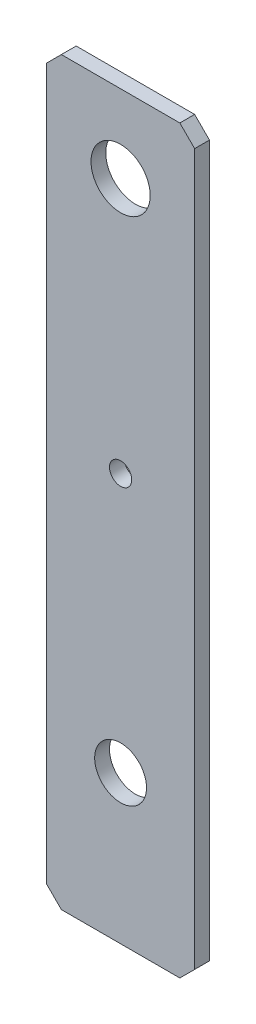
ISO-10303-21;
HEADER;
FILE_DESCRIPTION(('STEP AP214'),'2;1');
FILE_NAME('part.step','',(''),(''),'','','');
FILE_SCHEMA(('AUTOMOTIVE_DESIGN { 1 0 10303 214 1 1 1 1 }'));
ENDSEC;
DATA;
#1=APPLICATION_CONTEXT('core data for automotive mechanical design processes');
#2=APPLICATION_PROTOCOL_DEFINITION('international standard','automotive_design',2000,#1);
#3=PRODUCT_CONTEXT('',#1,'mechanical');
#4=PRODUCT('Part','Part','',(#3));
#5=PRODUCT_RELATED_PRODUCT_CATEGORY('part','',(#4));
#6=PRODUCT_DEFINITION_FORMATION('','',#4);
#7=PRODUCT_DEFINITION_CONTEXT('part definition',#1,'design');
#8=PRODUCT_DEFINITION('design','',#6,#7);
#9=PRODUCT_DEFINITION_SHAPE('','',#8);
#10=(LENGTH_UNIT() NAMED_UNIT(*) SI_UNIT(.MILLI.,.METRE.));
#11=(NAMED_UNIT(*) PLANE_ANGLE_UNIT() SI_UNIT($,.RADIAN.));
#12=(NAMED_UNIT(*) SI_UNIT($,.STERADIAN.) SOLID_ANGLE_UNIT());
#13=UNCERTAINTY_MEASURE_WITH_UNIT(LENGTH_MEASURE(1.E-05),#10,'distance_accuracy_value','');
#14=(GEOMETRIC_REPRESENTATION_CONTEXT(3) GLOBAL_UNCERTAINTY_ASSIGNED_CONTEXT((#13)) GLOBAL_UNIT_ASSIGNED_CONTEXT((#10,
#11,#12)) REPRESENTATION_CONTEXT('',''));
#15=CARTESIAN_POINT('',(0.,0.,0.));
#16=DIRECTION('',(0.,0.,1.));
#17=DIRECTION('',(1.,0.,0.));
#18=AXIS2_PLACEMENT_3D('',#15,#16,#17);
#19=CARTESIAN_POINT('',(9.99999999999999,50.,2.));
#20=DIRECTION('',(-1.,0.,0.));
#21=DIRECTION('',(0.,-1.,0.));
#22=AXIS2_PLACEMENT_3D('',#19,#20,#21);
#23=PLANE('',#22);
#24=DIRECTION('',(0.,1.,0.));
#25=VECTOR('',#24,1.);
#26=CARTESIAN_POINT('',(9.99999999999999,50.,0.));
#27=LINE('',#26,#25);
#28=CARTESIAN_POINT('',(10.,-48.,0.));
#29=VERTEX_POINT('',#28);
#30=CARTESIAN_POINT('',(9.99999999999999,48.,0.));
#31=VERTEX_POINT('',#30);
#32=EDGE_CURVE('E135',#29,#31,#27,.T.);
#33=ORIENTED_EDGE('',*,*,#32,.T.);
#34=DIRECTION('',(0.,0.,1.));
#35=VECTOR('',#34,1.);
#36=CARTESIAN_POINT('',(9.99999999999999,48.,2.));
#37=LINE('',#36,#35);
#38=CARTESIAN_POINT('',(9.99999999999999,48.,2.));
#39=VERTEX_POINT('',#38);
#40=EDGE_CURVE('E113',#31,#39,#37,.T.);
#41=ORIENTED_EDGE('',*,*,#40,.T.);
#42=DIRECTION('',(0.,1.,0.));
#43=VECTOR('',#42,1.);
#44=CARTESIAN_POINT('',(9.99999999999999,50.,2.));
#45=LINE('',#44,#43);
#46=CARTESIAN_POINT('',(10.,-48.,2.));
#47=VERTEX_POINT('',#46);
#48=EDGE_CURVE('E145',#47,#39,#45,.T.);
#49=ORIENTED_EDGE('',*,*,#48,.F.);
#50=DIRECTION('',(0.,0.,-1.));
#51=VECTOR('',#50,1.);
#52=CARTESIAN_POINT('',(10.,-48.,2.));
#53=LINE('',#52,#51);
#54=EDGE_CURVE('E118',#47,#29,#53,.T.);
#55=ORIENTED_EDGE('',*,*,#54,.T.);
#56=EDGE_LOOP('',(#33,#41,#49,#55));
#57=FACE_BOUND('',#56,.T.);
#58=ADVANCED_FACE('F41',(#57),#23,.F.);
#59=CARTESIAN_POINT('',(-10.,50.,2.));
#60=DIRECTION('',(0.,-1.,0.));
#61=DIRECTION('',(0.,0.,-1.));
#62=AXIS2_PLACEMENT_3D('',#59,#60,#61);
#63=PLANE('',#62);
#64=DIRECTION('',(-1.,0.,0.));
#65=VECTOR('',#64,1.);
#66=CARTESIAN_POINT('',(-10.,50.,2.));
#67=LINE('',#66,#65);
#68=CARTESIAN_POINT('',(7.99999999999999,50.,2.));
#69=VERTEX_POINT('',#68);
#70=CARTESIAN_POINT('',(-8.,50.,2.));
#71=VERTEX_POINT('',#70);
#72=EDGE_CURVE('E128',#69,#71,#67,.T.);
#73=ORIENTED_EDGE('',*,*,#72,.F.);
#74=DIRECTION('',(0.,0.,-1.));
#75=VECTOR('',#74,1.);
#76=CARTESIAN_POINT('',(7.99999999999999,50.,2.));
#77=LINE('',#76,#75);
#78=CARTESIAN_POINT('',(7.99999999999999,50.,0.));
#79=VERTEX_POINT('',#78);
#80=EDGE_CURVE('E112',#69,#79,#77,.T.);
#81=ORIENTED_EDGE('',*,*,#80,.T.);
#82=DIRECTION('',(-1.,0.,0.));
#83=VECTOR('',#82,1.);
#84=CARTESIAN_POINT('',(-10.,50.,0.));
#85=LINE('',#84,#83);
#86=CARTESIAN_POINT('',(-8.,50.,0.));
#87=VERTEX_POINT('',#86);
#88=EDGE_CURVE('E125',#79,#87,#85,.T.);
#89=ORIENTED_EDGE('',*,*,#88,.T.);
#90=DIRECTION('',(0.,0.,1.));
#91=VECTOR('',#90,1.);
#92=CARTESIAN_POINT('',(-8.,50.,2.));
#93=LINE('',#92,#91);
#94=EDGE_CURVE('E130',#87,#71,#93,.T.);
#95=ORIENTED_EDGE('',*,*,#94,.T.);
#96=EDGE_LOOP('',(#73,#81,#89,#95));
#97=FACE_BOUND('',#96,.T.);
#98=ADVANCED_FACE('F124',(#97),#63,.F.);
#99=CARTESIAN_POINT('',(-10.,50.,2.));
#100=DIRECTION('',(1.,0.,0.));
#101=DIRECTION('',(0.,1.,0.));
#102=AXIS2_PLACEMENT_3D('',#99,#100,#101);
#103=PLANE('',#102);
#104=DIRECTION('',(0.,-1.,0.));
#105=VECTOR('',#104,1.);
#106=CARTESIAN_POINT('',(-10.,50.,0.));
#107=LINE('',#106,#105);
#108=CARTESIAN_POINT('',(-10.,48.,0.));
#109=VERTEX_POINT('',#108);
#110=CARTESIAN_POINT('',(-9.99999999999999,-48.,0.));
#111=VERTEX_POINT('',#110);
#112=EDGE_CURVE('E134',#109,#111,#107,.T.);
#113=ORIENTED_EDGE('',*,*,#112,.T.);
#114=DIRECTION('',(0.,0.,1.));
#115=VECTOR('',#114,1.);
#116=CARTESIAN_POINT('',(-9.99999999999999,-48.,2.));
#117=LINE('',#116,#115);
#118=CARTESIAN_POINT('',(-9.99999999999999,-48.,2.));
#119=VERTEX_POINT('',#118);
#120=EDGE_CURVE('E11',#111,#119,#117,.T.);
#121=ORIENTED_EDGE('',*,*,#120,.T.);
#122=DIRECTION('',(0.,-1.,0.));
#123=VECTOR('',#122,1.);
#124=CARTESIAN_POINT('',(-10.,50.,2.));
#125=LINE('',#124,#123);
#126=CARTESIAN_POINT('',(-10.,48.,2.));
#127=VERTEX_POINT('',#126);
#128=EDGE_CURVE('E171',#127,#119,#125,.T.);
#129=ORIENTED_EDGE('',*,*,#128,.F.);
#130=DIRECTION('',(0.,0.,-1.));
#131=VECTOR('',#130,1.);
#132=CARTESIAN_POINT('',(-10.,48.,2.));
#133=LINE('',#132,#131);
#134=EDGE_CURVE('E50',#127,#109,#133,.T.);
#135=ORIENTED_EDGE('',*,*,#134,.T.);
#136=EDGE_LOOP('',(#113,#121,#129,#135));
#137=FACE_BOUND('',#136,.T.);
#138=ADVANCED_FACE('F169',(#137),#103,.F.);
#139=CARTESIAN_POINT('',(-9.99999999999999,-50.,2.));
#140=DIRECTION('',(0.,1.,0.));
#141=DIRECTION('',(0.,0.,1.));
#142=AXIS2_PLACEMENT_3D('',#139,#140,#141);
#143=PLANE('',#142);
#144=DIRECTION('',(1.,0.,0.));
#145=VECTOR('',#144,1.);
#146=CARTESIAN_POINT('',(-9.99999999999999,-50.,0.));
#147=LINE('',#146,#145);
#148=CARTESIAN_POINT('',(-7.99999999999998,-50.,0.));
#149=VERTEX_POINT('',#148);
#150=CARTESIAN_POINT('',(8.00000000000001,-50.,0.));
#151=VERTEX_POINT('',#150);
#152=EDGE_CURVE('E138',#149,#151,#147,.T.);
#153=ORIENTED_EDGE('',*,*,#152,.T.);
#154=DIRECTION('',(0.,0.,1.));
#155=VECTOR('',#154,1.);
#156=CARTESIAN_POINT('',(8.00000000000001,-50.,2.));
#157=LINE('',#156,#155);
#158=CARTESIAN_POINT('',(8.00000000000001,-50.,2.));
#159=VERTEX_POINT('',#158);
#160=EDGE_CURVE('E57',#151,#159,#157,.T.);
#161=ORIENTED_EDGE('',*,*,#160,.T.);
#162=DIRECTION('',(1.,0.,0.));
#163=VECTOR('',#162,1.);
#164=CARTESIAN_POINT('',(-9.99999999999999,-50.,2.));
#165=LINE('',#164,#163);
#166=CARTESIAN_POINT('',(-7.99999999999998,-50.,2.));
#167=VERTEX_POINT('',#166);
#168=EDGE_CURVE('E146',#167,#159,#165,.T.);
#169=ORIENTED_EDGE('',*,*,#168,.F.);
#170=DIRECTION('',(0.,0.,-1.));
#171=VECTOR('',#170,1.);
#172=CARTESIAN_POINT('',(-7.99999999999998,-50.,2.));
#173=LINE('',#172,#171);
#174=EDGE_CURVE('E162',#167,#149,#173,.T.);
#175=ORIENTED_EDGE('',*,*,#174,.T.);
#176=EDGE_LOOP('',(#153,#161,#169,#175));
#177=FACE_BOUND('',#176,.T.);
#178=ADVANCED_FACE('F178',(#177),#143,.F.);
#179=CARTESIAN_POINT('',(0.,0.,2.));
#180=DIRECTION('',(0.,0.,1.));
#181=DIRECTION('',(1.,0.,0.));
#182=AXIS2_PLACEMENT_3D('',#179,#180,#181);
#183=PLANE('',#182);
#184=CARTESIAN_POINT('',(0.,39.5,2.));
#185=DIRECTION('',(0.,0.,1.));
#186=DIRECTION('',(1.,0.,0.));
#187=AXIS2_PLACEMENT_3D('',#184,#185,#186);
#188=CIRCLE('',#187,4.);
#189=CARTESIAN_POINT('',(4.00000000000001,39.5,2.));
#190=VERTEX_POINT('',#189);
#191=EDGE_CURVE('E191',#190,#190,#188,.T.);
#192=ORIENTED_EDGE('',*,*,#191,.F.);
#193=EDGE_LOOP('',(#192));
#194=FACE_BOUND('',#193,.T.);
#195=CARTESIAN_POINT('',(0.,-30.,2.));
#196=DIRECTION('',(0.,0.,1.));
#197=DIRECTION('',(1.,0.,0.));
#198=AXIS2_PLACEMENT_3D('',#195,#196,#197);
#199=CIRCLE('',#198,3.5);
#200=CARTESIAN_POINT('',(3.50000000000001,-30.,2.));
#201=VERTEX_POINT('',#200);
#202=EDGE_CURVE('E190',#201,#201,#199,.T.);
#203=ORIENTED_EDGE('',*,*,#202,.F.);
#204=EDGE_LOOP('',(#203));
#205=FACE_BOUND('',#204,.T.);
#206=CARTESIAN_POINT('',(0.,5.,2.));
#207=DIRECTION('',(0.,0.,1.));
#208=DIRECTION('',(1.,0.,0.));
#209=AXIS2_PLACEMENT_3D('',#206,#207,#208);
#210=CIRCLE('',#209,1.5);
#211=CARTESIAN_POINT('',(1.50000000000001,5.,2.));
#212=VERTEX_POINT('',#211);
#213=EDGE_CURVE('E187',#212,#212,#210,.T.);
#214=ORIENTED_EDGE('',*,*,#213,.F.);
#215=EDGE_LOOP('',(#214));
#216=FACE_BOUND('',#215,.T.);
#217=ORIENTED_EDGE('',*,*,#48,.T.);
#218=DIRECTION('',(0.707106781186548,-0.707106781186548,0.));
#219=VECTOR('',#218,1.);
#220=CARTESIAN_POINT('',(29.,29.,2.));
#221=LINE('',#220,#219);
#222=EDGE_CURVE('E160',#39,#69,#221,.F.);
#223=ORIENTED_EDGE('',*,*,#222,.T.);
#224=ORIENTED_EDGE('',*,*,#72,.T.);
#225=DIRECTION('',(0.707106781186548,0.707106781186548,0.));
#226=VECTOR('',#225,1.);
#227=CARTESIAN_POINT('',(-29.,29.,2.));
#228=LINE('',#227,#226);
#229=EDGE_CURVE('E155',#71,#127,#228,.F.);
#230=ORIENTED_EDGE('',*,*,#229,.T.);
#231=ORIENTED_EDGE('',*,*,#128,.T.);
#232=DIRECTION('',(-0.707106781186548,0.707106781186548,0.));
#233=VECTOR('',#232,1.);
#234=CARTESIAN_POINT('',(-29.,-29.,2.));
#235=LINE('',#234,#233);
#236=EDGE_CURVE('E64',#119,#167,#235,.F.);
#237=ORIENTED_EDGE('',*,*,#236,.T.);
#238=ORIENTED_EDGE('',*,*,#168,.T.);
#239=DIRECTION('',(-0.707106781186548,-0.707106781186548,0.));
#240=VECTOR('',#239,1.);
#241=CARTESIAN_POINT('',(29.,-29.,2.));
#242=LINE('',#241,#240);
#243=EDGE_CURVE('E158',#159,#47,#242,.F.);
#244=ORIENTED_EDGE('',*,*,#243,.T.);
#245=EDGE_LOOP('',(#217,#223,#224,#230,#231,#237,#238,#244));
#246=FACE_BOUND('',#245,.T.);
#247=ADVANCED_FACE('F208',(#194,#205,#216,#246),#183,.T.);
#248=CARTESIAN_POINT('',(0.,0.,0.));
#249=DIRECTION('',(0.,0.,1.));
#250=DIRECTION('',(1.,0.,0.));
#251=AXIS2_PLACEMENT_3D('',#248,#249,#250);
#252=PLANE('',#251);
#253=CARTESIAN_POINT('',(0.,39.5,0.));
#254=DIRECTION('',(0.,0.,1.));
#255=DIRECTION('',(1.,0.,0.));
#256=AXIS2_PLACEMENT_3D('',#253,#254,#255);
#257=CIRCLE('',#256,4.);
#258=CARTESIAN_POINT('',(4.00000000000001,39.5,0.));
#259=VERTEX_POINT('',#258);
#260=EDGE_CURVE('E195',#259,#259,#257,.F.);
#261=ORIENTED_EDGE('',*,*,#260,.F.);
#262=EDGE_LOOP('',(#261));
#263=FACE_BOUND('',#262,.T.);
#264=CARTESIAN_POINT('',(0.,-30.,0.));
#265=DIRECTION('',(0.,0.,1.));
#266=DIRECTION('',(1.,0.,0.));
#267=AXIS2_PLACEMENT_3D('',#264,#265,#266);
#268=CIRCLE('',#267,3.5);
#269=CARTESIAN_POINT('',(3.50000000000001,-30.,0.));
#270=VERTEX_POINT('',#269);
#271=EDGE_CURVE('E194',#270,#270,#268,.F.);
#272=ORIENTED_EDGE('',*,*,#271,.F.);
#273=EDGE_LOOP('',(#272));
#274=FACE_BOUND('',#273,.T.);
#275=CARTESIAN_POINT('',(0.,5.,0.));
#276=DIRECTION('',(0.,0.,1.));
#277=DIRECTION('',(1.,0.,0.));
#278=AXIS2_PLACEMENT_3D('',#275,#276,#277);
#279=CIRCLE('',#278,1.5);
#280=CARTESIAN_POINT('',(1.50000000000001,5.,0.));
#281=VERTEX_POINT('',#280);
#282=EDGE_CURVE('E140',#281,#281,#279,.F.);
#283=ORIENTED_EDGE('',*,*,#282,.F.);
#284=EDGE_LOOP('',(#283));
#285=FACE_BOUND('',#284,.T.);
#286=ORIENTED_EDGE('',*,*,#88,.F.);
#287=DIRECTION('',(-0.707106781186548,0.707106781186548,0.));
#288=VECTOR('',#287,1.);
#289=CARTESIAN_POINT('',(7.99999999999999,50.,0.));
#290=LINE('',#289,#288);
#291=EDGE_CURVE('E108',#79,#31,#290,.F.);
#292=ORIENTED_EDGE('',*,*,#291,.T.);
#293=ORIENTED_EDGE('',*,*,#32,.F.);
#294=DIRECTION('',(0.707106781186548,0.707106781186548,0.));
#295=VECTOR('',#294,1.);
#296=CARTESIAN_POINT('',(10.,-48.,0.));
#297=LINE('',#296,#295);
#298=EDGE_CURVE('E119',#29,#151,#297,.F.);
#299=ORIENTED_EDGE('',*,*,#298,.T.);
#300=ORIENTED_EDGE('',*,*,#152,.F.);
#301=DIRECTION('',(0.707106781186548,-0.707106781186548,0.));
#302=VECTOR('',#301,1.);
#303=CARTESIAN_POINT('',(-7.99999999999998,-50.,0.));
#304=LINE('',#303,#302);
#305=EDGE_CURVE('E149',#149,#111,#304,.F.);
#306=ORIENTED_EDGE('',*,*,#305,.T.);
#307=ORIENTED_EDGE('',*,*,#112,.F.);
#308=DIRECTION('',(-0.707106781186548,-0.707106781186548,0.));
#309=VECTOR('',#308,1.);
#310=CARTESIAN_POINT('',(-10.,48.,0.));
#311=LINE('',#310,#309);
#312=EDGE_CURVE('E129',#109,#87,#311,.F.);
#313=ORIENTED_EDGE('',*,*,#312,.T.);
#314=EDGE_LOOP('',(#286,#292,#293,#299,#300,#306,#307,#313));
#315=FACE_BOUND('',#314,.T.);
#316=ADVANCED_FACE('F132',(#263,#274,#285,#315),#252,.F.);
#317=CARTESIAN_POINT('',(0.,5.,-0.00100000000000013));
#318=DIRECTION('',(0.,0.,1.));
#319=DIRECTION('',(1.,0.,0.));
#320=AXIS2_PLACEMENT_3D('',#317,#318,#319);
#321=CYLINDRICAL_SURFACE('',#320,1.5);
#322=ORIENTED_EDGE('',*,*,#213,.T.);
#323=EDGE_LOOP('',(#322));
#324=FACE_BOUND('',#323,.T.);
#325=ORIENTED_EDGE('',*,*,#282,.T.);
#326=EDGE_LOOP('',(#325));
#327=FACE_BOUND('',#326,.T.);
#328=ADVANCED_FACE('F207',(#324,#327),#321,.F.);
#329=CARTESIAN_POINT('',(0.,-30.,-0.00100000000000013));
#330=DIRECTION('',(0.,0.,1.));
#331=DIRECTION('',(1.,0.,0.));
#332=AXIS2_PLACEMENT_3D('',#329,#330,#331);
#333=CYLINDRICAL_SURFACE('',#332,3.5);
#334=ORIENTED_EDGE('',*,*,#202,.T.);
#335=EDGE_LOOP('',(#334));
#336=FACE_BOUND('',#335,.T.);
#337=ORIENTED_EDGE('',*,*,#271,.T.);
#338=EDGE_LOOP('',(#337));
#339=FACE_BOUND('',#338,.T.);
#340=ADVANCED_FACE('F203',(#336,#339),#333,.F.);
#341=CARTESIAN_POINT('',(0.,39.5,-0.00100000000000013));
#342=DIRECTION('',(0.,0.,1.));
#343=DIRECTION('',(1.,0.,0.));
#344=AXIS2_PLACEMENT_3D('',#341,#342,#343);
#345=CYLINDRICAL_SURFACE('',#344,4.);
#346=ORIENTED_EDGE('',*,*,#191,.T.);
#347=EDGE_LOOP('',(#346));
#348=FACE_BOUND('',#347,.T.);
#349=ORIENTED_EDGE('',*,*,#260,.T.);
#350=EDGE_LOOP('',(#349));
#351=FACE_BOUND('',#350,.T.);
#352=ADVANCED_FACE('F219',(#348,#351),#345,.F.);
#353=CARTESIAN_POINT('',(7.99999999999999,50.,2.));
#354=DIRECTION('',(-0.707106781186547,-0.707106781186547,0.));
#355=DIRECTION('',(0.,0.,-1.));
#356=AXIS2_PLACEMENT_3D('',#353,#354,#355);
#357=PLANE('',#356);
#358=ORIENTED_EDGE('',*,*,#222,.F.);
#359=ORIENTED_EDGE('',*,*,#40,.F.);
#360=ORIENTED_EDGE('',*,*,#291,.F.);
#361=ORIENTED_EDGE('',*,*,#80,.F.);
#362=EDGE_LOOP('',(#358,#359,#360,#361));
#363=FACE_BOUND('',#362,.T.);
#364=ADVANCED_FACE('F111',(#363),#357,.F.);
#365=CARTESIAN_POINT('',(10.,-48.,2.));
#366=DIRECTION('',(-0.707106781186547,0.707106781186547,0.));
#367=DIRECTION('',(0.,0.,-1.));
#368=AXIS2_PLACEMENT_3D('',#365,#366,#367);
#369=PLANE('',#368);
#370=ORIENTED_EDGE('',*,*,#243,.F.);
#371=ORIENTED_EDGE('',*,*,#160,.F.);
#372=ORIENTED_EDGE('',*,*,#298,.F.);
#373=ORIENTED_EDGE('',*,*,#54,.F.);
#374=EDGE_LOOP('',(#370,#371,#372,#373));
#375=FACE_BOUND('',#374,.T.);
#376=ADVANCED_FACE('F240',(#375),#369,.F.);
#377=CARTESIAN_POINT('',(-7.99999999999998,-50.,2.));
#378=DIRECTION('',(0.707106781186547,0.707106781186547,0.));
#379=DIRECTION('',(0.,0.,-1.));
#380=AXIS2_PLACEMENT_3D('',#377,#378,#379);
#381=PLANE('',#380);
#382=ORIENTED_EDGE('',*,*,#236,.F.);
#383=ORIENTED_EDGE('',*,*,#120,.F.);
#384=ORIENTED_EDGE('',*,*,#305,.F.);
#385=ORIENTED_EDGE('',*,*,#174,.F.);
#386=EDGE_LOOP('',(#382,#383,#384,#385));
#387=FACE_BOUND('',#386,.T.);
#388=ADVANCED_FACE('F177',(#387),#381,.F.);
#389=CARTESIAN_POINT('',(-10.,48.,2.));
#390=DIRECTION('',(0.707106781186547,-0.707106781186547,0.));
#391=DIRECTION('',(0.,0.,-1.));
#392=AXIS2_PLACEMENT_3D('',#389,#390,#391);
#393=PLANE('',#392);
#394=ORIENTED_EDGE('',*,*,#229,.F.);
#395=ORIENTED_EDGE('',*,*,#94,.F.);
#396=ORIENTED_EDGE('',*,*,#312,.F.);
#397=ORIENTED_EDGE('',*,*,#134,.F.);
#398=EDGE_LOOP('',(#394,#395,#396,#397));
#399=FACE_BOUND('',#398,.T.);
#400=ADVANCED_FACE('F44',(#399),#393,.F.);
#401=CLOSED_SHELL('',(#58,#98,#138,#178,#247,#316,#328,#340,#352,#364,#376,#388,#400));
#402=MANIFOLD_SOLID_BREP('B2',#401);
#403=ADVANCED_BREP_SHAPE_REPRESENTATION('',(#18,#402),#14);
#404=SHAPE_DEFINITION_REPRESENTATION(#9,#403);
ENDSEC;
END-ISO-10303-21;
